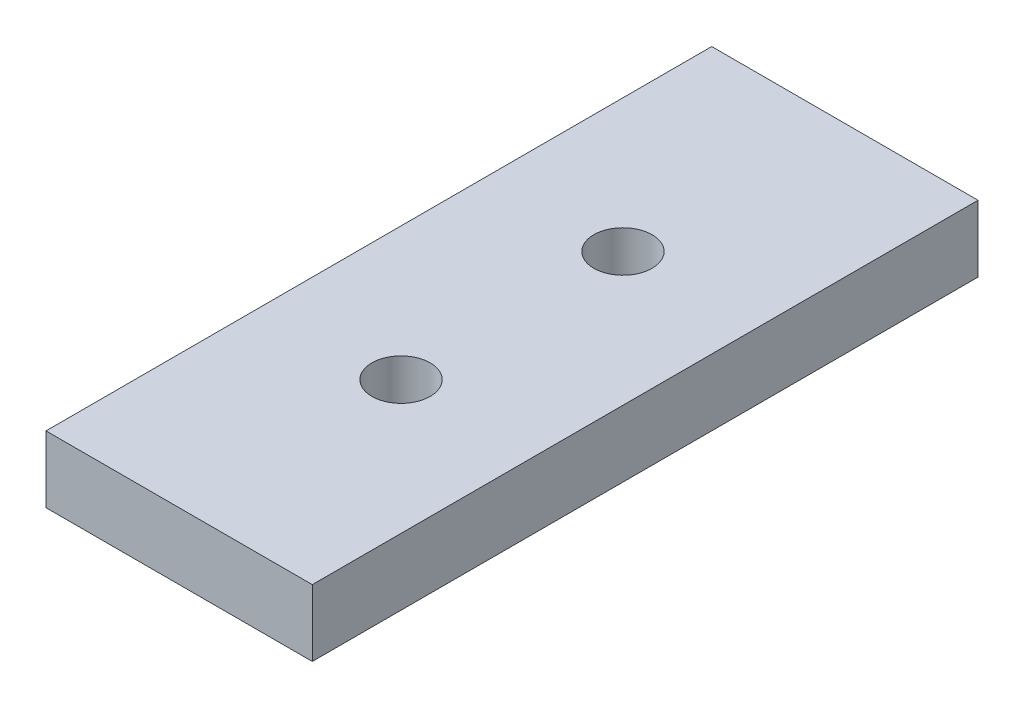
ISO-10303-21;
HEADER;
FILE_DESCRIPTION(('STEP AP214'),'2;1');
FILE_NAME('part.step','',(''),(''),'','','');
FILE_SCHEMA(('AUTOMOTIVE_DESIGN { 1 0 10303 214 1 1 1 1 }'));
ENDSEC;
DATA;
#1=APPLICATION_CONTEXT('core data for automotive mechanical design processes');
#2=APPLICATION_PROTOCOL_DEFINITION('international standard','automotive_design',2000,#1);
#3=PRODUCT_CONTEXT('',#1,'mechanical');
#4=PRODUCT('Part','Part','',(#3));
#5=PRODUCT_RELATED_PRODUCT_CATEGORY('part','',(#4));
#6=PRODUCT_DEFINITION_FORMATION('','',#4);
#7=PRODUCT_DEFINITION_CONTEXT('part definition',#1,'design');
#8=PRODUCT_DEFINITION('design','',#6,#7);
#9=PRODUCT_DEFINITION_SHAPE('','',#8);
#10=(LENGTH_UNIT() NAMED_UNIT(*) SI_UNIT(.MILLI.,.METRE.));
#11=(NAMED_UNIT(*) PLANE_ANGLE_UNIT() SI_UNIT($,.RADIAN.));
#12=(NAMED_UNIT(*) SI_UNIT($,.STERADIAN.) SOLID_ANGLE_UNIT());
#13=UNCERTAINTY_MEASURE_WITH_UNIT(LENGTH_MEASURE(1.E-05),#10,'distance_accuracy_value','');
#14=(GEOMETRIC_REPRESENTATION_CONTEXT(3) GLOBAL_UNCERTAINTY_ASSIGNED_CONTEXT((#13)) GLOBAL_UNIT_ASSIGNED_CONTEXT((#10,
#11,#12)) REPRESENTATION_CONTEXT('',''));
#15=CARTESIAN_POINT('',(0.,0.,0.));
#16=DIRECTION('',(0.,0.,1.));
#17=DIRECTION('',(1.,0.,0.));
#18=AXIS2_PLACEMENT_3D('',#15,#16,#17);
#19=CARTESIAN_POINT('',(0.,-6.35,0.));
#20=DIRECTION('',(1.,0.,0.));
#21=DIRECTION('',(0.,0.,-1.));
#22=AXIS2_PLACEMENT_3D('',#19,#20,#21);
#23=PLANE('',#22);
#24=DIRECTION('',(0.,0.,-1.));
#25=VECTOR('',#24,1.);
#26=CARTESIAN_POINT('',(0.,0.,0.));
#27=LINE('',#26,#25);
#28=CARTESIAN_POINT('',(0.,0.,0.));
#29=VERTEX_POINT('',#28);
#30=CARTESIAN_POINT('',(0.,0.,-63.5));
#31=VERTEX_POINT('',#30);
#32=EDGE_CURVE('E122',#29,#31,#27,.T.);
#33=ORIENTED_EDGE('',*,*,#32,.F.);
#34=DIRECTION('',(0.,1.,0.));
#35=VECTOR('',#34,1.);
#36=CARTESIAN_POINT('',(0.,-6.35,0.));
#37=LINE('',#36,#35);
#38=CARTESIAN_POINT('',(0.,-6.35,0.));
#39=VERTEX_POINT('',#38);
#40=EDGE_CURVE('E11',#39,#29,#37,.T.);
#41=ORIENTED_EDGE('',*,*,#40,.F.);
#42=DIRECTION('',(0.,0.,-1.));
#43=VECTOR('',#42,1.);
#44=CARTESIAN_POINT('',(0.,-6.35,0.));
#45=LINE('',#44,#43);
#46=CARTESIAN_POINT('',(0.,-6.35,-63.5));
#47=VERTEX_POINT('',#46);
#48=EDGE_CURVE('E112',#39,#47,#45,.T.);
#49=ORIENTED_EDGE('',*,*,#48,.T.);
#50=DIRECTION('',(0.,1.,0.));
#51=VECTOR('',#50,1.);
#52=CARTESIAN_POINT('',(0.,-6.35,-63.5));
#53=LINE('',#52,#51);
#54=EDGE_CURVE('E45',#47,#31,#53,.T.);
#55=ORIENTED_EDGE('',*,*,#54,.T.);
#56=EDGE_LOOP('',(#33,#41,#49,#55));
#57=FACE_BOUND('',#56,.T.);
#58=ADVANCED_FACE('F42',(#57),#23,.T.);
#59=CARTESIAN_POINT('',(0.,-6.35,0.));
#60=DIRECTION('',(0.,0.,1.));
#61=DIRECTION('',(1.,0.,0.));
#62=AXIS2_PLACEMENT_3D('',#59,#60,#61);
#63=PLANE('',#62);
#64=DIRECTION('',(1.,0.,0.));
#65=VECTOR('',#64,1.);
#66=CARTESIAN_POINT('',(0.,0.,0.));
#67=LINE('',#66,#65);
#68=CARTESIAN_POINT('',(-25.4,0.,0.));
#69=VERTEX_POINT('',#68);
#70=EDGE_CURVE('E116',#69,#29,#67,.T.);
#71=ORIENTED_EDGE('',*,*,#70,.F.);
#72=DIRECTION('',(0.,1.,0.));
#73=VECTOR('',#72,1.);
#74=CARTESIAN_POINT('',(-25.4,-6.35,0.));
#75=LINE('',#74,#73);
#76=CARTESIAN_POINT('',(-25.4,-6.35,0.));
#77=VERTEX_POINT('',#76);
#78=EDGE_CURVE('E52',#77,#69,#75,.T.);
#79=ORIENTED_EDGE('',*,*,#78,.F.);
#80=DIRECTION('',(1.,0.,0.));
#81=VECTOR('',#80,1.);
#82=CARTESIAN_POINT('',(0.,-6.35,0.));
#83=LINE('',#82,#81);
#84=EDGE_CURVE('E107',#77,#39,#83,.T.);
#85=ORIENTED_EDGE('',*,*,#84,.T.);
#86=ORIENTED_EDGE('',*,*,#40,.T.);
#87=EDGE_LOOP('',(#71,#79,#85,#86));
#88=FACE_BOUND('',#87,.T.);
#89=ADVANCED_FACE('F138',(#88),#63,.T.);
#90=CARTESIAN_POINT('',(-25.4,-6.35,0.));
#91=DIRECTION('',(-1.,0.,0.));
#92=DIRECTION('',(0.,0.,1.));
#93=AXIS2_PLACEMENT_3D('',#90,#91,#92);
#94=PLANE('',#93);
#95=DIRECTION('',(0.,0.,1.));
#96=VECTOR('',#95,1.);
#97=CARTESIAN_POINT('',(-25.4,0.,0.));
#98=LINE('',#97,#96);
#99=CARTESIAN_POINT('',(-25.4,0.,-63.5));
#100=VERTEX_POINT('',#99);
#101=EDGE_CURVE('E101',#100,#69,#98,.T.);
#102=ORIENTED_EDGE('',*,*,#101,.F.);
#103=DIRECTION('',(0.,1.,0.));
#104=VECTOR('',#103,1.);
#105=CARTESIAN_POINT('',(-25.4,-6.35,-63.5));
#106=LINE('',#105,#104);
#107=CARTESIAN_POINT('',(-25.4,-6.35,-63.5));
#108=VERTEX_POINT('',#107);
#109=EDGE_CURVE('E96',#108,#100,#106,.T.);
#110=ORIENTED_EDGE('',*,*,#109,.F.);
#111=DIRECTION('',(0.,0.,1.));
#112=VECTOR('',#111,1.);
#113=CARTESIAN_POINT('',(-25.4,-6.35,0.));
#114=LINE('',#113,#112);
#115=EDGE_CURVE('E99',#108,#77,#114,.T.);
#116=ORIENTED_EDGE('',*,*,#115,.T.);
#117=ORIENTED_EDGE('',*,*,#78,.T.);
#118=EDGE_LOOP('',(#102,#110,#116,#117));
#119=FACE_BOUND('',#118,.T.);
#120=ADVANCED_FACE('F98',(#119),#94,.T.);
#121=CARTESIAN_POINT('',(0.,-6.35,-63.5));
#122=DIRECTION('',(0.,0.,-1.));
#123=DIRECTION('',(-1.,0.,0.));
#124=AXIS2_PLACEMENT_3D('',#121,#122,#123);
#125=PLANE('',#124);
#126=DIRECTION('',(-1.,0.,0.));
#127=VECTOR('',#126,1.);
#128=CARTESIAN_POINT('',(0.,0.,-63.5));
#129=LINE('',#128,#127);
#130=EDGE_CURVE('E126',#31,#100,#129,.T.);
#131=ORIENTED_EDGE('',*,*,#130,.F.);
#132=ORIENTED_EDGE('',*,*,#54,.F.);
#133=DIRECTION('',(-1.,0.,0.));
#134=VECTOR('',#133,1.);
#135=CARTESIAN_POINT('',(0.,-6.35,-63.5));
#136=LINE('',#135,#134);
#137=EDGE_CURVE('E106',#47,#108,#136,.T.);
#138=ORIENTED_EDGE('',*,*,#137,.T.);
#139=ORIENTED_EDGE('',*,*,#109,.T.);
#140=EDGE_LOOP('',(#131,#132,#138,#139));
#141=FACE_BOUND('',#140,.T.);
#142=ADVANCED_FACE('F110',(#141),#125,.T.);
#143=CARTESIAN_POINT('',(0.,-6.35,0.));
#144=DIRECTION('',(0.,1.,0.));
#145=DIRECTION('',(0.,0.,1.));
#146=AXIS2_PLACEMENT_3D('',#143,#144,#145);
#147=PLANE('',#146);
#148=CARTESIAN_POINT('',(-12.7,-6.35,-21.1666666666667));
#149=DIRECTION('',(0.,1.,0.));
#150=DIRECTION('',(0.,0.,1.));
#151=AXIS2_PLACEMENT_3D('',#148,#149,#150);
#152=CIRCLE('',#151,2.778125);
#153=CARTESIAN_POINT('',(-12.7,-6.35,-18.3885416666667));
#154=VERTEX_POINT('',#153);
#155=EDGE_CURVE('E127',#154,#154,#152,.T.);
#156=ORIENTED_EDGE('',*,*,#155,.T.);
#157=EDGE_LOOP('',(#156));
#158=FACE_BOUND('',#157,.T.);
#159=CARTESIAN_POINT('',(-12.7,-6.35,-42.3333333333333));
#160=DIRECTION('',(0.,1.,0.));
#161=DIRECTION('',(0.,0.,1.));
#162=AXIS2_PLACEMENT_3D('',#159,#160,#161);
#163=CIRCLE('',#162,2.778125);
#164=CARTESIAN_POINT('',(-12.7,-6.35,-39.5552083333333));
#165=VERTEX_POINT('',#164);
#166=EDGE_CURVE('E175',#165,#165,#163,.T.);
#167=ORIENTED_EDGE('',*,*,#166,.T.);
#168=EDGE_LOOP('',(#167));
#169=FACE_BOUND('',#168,.T.);
#170=ORIENTED_EDGE('',*,*,#48,.F.);
#171=ORIENTED_EDGE('',*,*,#84,.F.);
#172=ORIENTED_EDGE('',*,*,#115,.F.);
#173=ORIENTED_EDGE('',*,*,#137,.F.);
#174=EDGE_LOOP('',(#170,#171,#172,#173));
#175=FACE_BOUND('',#174,.T.);
#176=ADVANCED_FACE('F105',(#158,#169,#175),#147,.F.);
#177=CARTESIAN_POINT('',(0.,0.,0.));
#178=DIRECTION('',(0.,1.,0.));
#179=DIRECTION('',(0.,0.,1.));
#180=AXIS2_PLACEMENT_3D('',#177,#178,#179);
#181=PLANE('',#180);
#182=CARTESIAN_POINT('',(-12.7,0.,-21.1666666666667));
#183=DIRECTION('',(0.,1.,0.));
#184=DIRECTION('',(0.,0.,1.));
#185=AXIS2_PLACEMENT_3D('',#182,#183,#184);
#186=CIRCLE('',#185,2.778125);
#187=CARTESIAN_POINT('',(-12.7,0.,-18.3885416666667));
#188=VERTEX_POINT('',#187);
#189=EDGE_CURVE('E173',#188,#188,#186,.T.);
#190=ORIENTED_EDGE('',*,*,#189,.F.);
#191=EDGE_LOOP('',(#190));
#192=FACE_BOUND('',#191,.T.);
#193=CARTESIAN_POINT('',(-12.7,0.,-42.3333333333333));
#194=DIRECTION('',(0.,1.,0.));
#195=DIRECTION('',(0.,0.,1.));
#196=AXIS2_PLACEMENT_3D('',#193,#194,#195);
#197=CIRCLE('',#196,2.778125);
#198=CARTESIAN_POINT('',(-12.7,0.,-39.5552083333333));
#199=VERTEX_POINT('',#198);
#200=EDGE_CURVE('E181',#199,#199,#197,.T.);
#201=ORIENTED_EDGE('',*,*,#200,.F.);
#202=EDGE_LOOP('',(#201));
#203=FACE_BOUND('',#202,.T.);
#204=ORIENTED_EDGE('',*,*,#32,.T.);
#205=ORIENTED_EDGE('',*,*,#130,.T.);
#206=ORIENTED_EDGE('',*,*,#101,.T.);
#207=ORIENTED_EDGE('',*,*,#70,.T.);
#208=EDGE_LOOP('',(#204,#205,#206,#207));
#209=FACE_BOUND('',#208,.T.);
#210=ADVANCED_FACE('F137',(#192,#203,#209),#181,.T.);
#211=CARTESIAN_POINT('',(-12.7,-6.35,-42.3333333333333));
#212=DIRECTION('',(0.,1.,0.));
#213=DIRECTION('',(0.,0.,1.));
#214=AXIS2_PLACEMENT_3D('',#211,#212,#213);
#215=CYLINDRICAL_SURFACE('',#214,2.778125);
#216=ORIENTED_EDGE('',*,*,#166,.F.);
#217=EDGE_LOOP('',(#216));
#218=FACE_BOUND('',#217,.T.);
#219=ORIENTED_EDGE('',*,*,#200,.T.);
#220=EDGE_LOOP('',(#219));
#221=FACE_BOUND('',#220,.T.);
#222=ADVANCED_FACE('F156',(#218,#221),#215,.F.);
#223=CARTESIAN_POINT('',(-12.7,-6.35,-21.1666666666667));
#224=DIRECTION('',(0.,1.,0.));
#225=DIRECTION('',(0.,0.,1.));
#226=AXIS2_PLACEMENT_3D('',#223,#224,#225);
#227=CYLINDRICAL_SURFACE('',#226,2.778125);
#228=ORIENTED_EDGE('',*,*,#155,.F.);
#229=EDGE_LOOP('',(#228));
#230=FACE_BOUND('',#229,.T.);
#231=ORIENTED_EDGE('',*,*,#189,.T.);
#232=EDGE_LOOP('',(#231));
#233=FACE_BOUND('',#232,.T.);
#234=ADVANCED_FACE('F163',(#230,#233),#227,.F.);
#235=CLOSED_SHELL('',(#58,#89,#120,#142,#176,#210,#222,#234));
#236=MANIFOLD_SOLID_BREP('B2',#235);
#237=ADVANCED_BREP_SHAPE_REPRESENTATION('',(#18,#236),#14);
#238=SHAPE_DEFINITION_REPRESENTATION(#9,#237);
ENDSEC;
END-ISO-10303-21;
